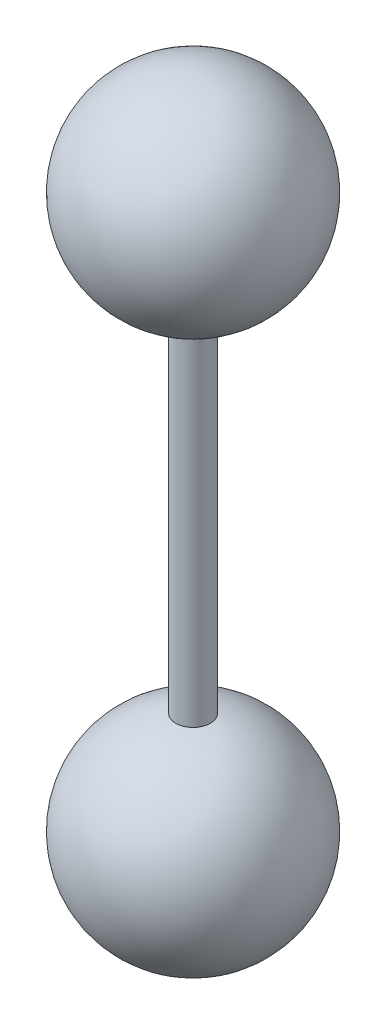
ISO-10303-21;
HEADER;
FILE_DESCRIPTION(('STEP AP214'),'2;1');
FILE_NAME('part.step','',(''),(''),'','','');
FILE_SCHEMA(('AUTOMOTIVE_DESIGN { 1 0 10303 214 1 1 1 1 }'));
ENDSEC;
DATA;
#1=APPLICATION_CONTEXT('core data for automotive mechanical design processes');
#2=APPLICATION_PROTOCOL_DEFINITION('international standard','automotive_design',2000,#1);
#3=PRODUCT_CONTEXT('',#1,'mechanical');
#4=PRODUCT('Part','Part','',(#3));
#5=PRODUCT_RELATED_PRODUCT_CATEGORY('part','',(#4));
#6=PRODUCT_DEFINITION_FORMATION('','',#4);
#7=PRODUCT_DEFINITION_CONTEXT('part definition',#1,'design');
#8=PRODUCT_DEFINITION('design','',#6,#7);
#9=PRODUCT_DEFINITION_SHAPE('','',#8);
#10=(LENGTH_UNIT() NAMED_UNIT(*) SI_UNIT(.MILLI.,.METRE.));
#11=(NAMED_UNIT(*) PLANE_ANGLE_UNIT() SI_UNIT($,.RADIAN.));
#12=(NAMED_UNIT(*) SI_UNIT($,.STERADIAN.) SOLID_ANGLE_UNIT());
#13=UNCERTAINTY_MEASURE_WITH_UNIT(LENGTH_MEASURE(1.E-05),#10,'distance_accuracy_value','');
#14=(GEOMETRIC_REPRESENTATION_CONTEXT(3) GLOBAL_UNCERTAINTY_ASSIGNED_CONTEXT((#13)) GLOBAL_UNIT_ASSIGNED_CONTEXT((#10,
#11,#12)) REPRESENTATION_CONTEXT('',''));
#15=CARTESIAN_POINT('',(0.,0.,0.));
#16=DIRECTION('',(0.,0.,1.));
#17=DIRECTION('',(1.,0.,0.));
#18=AXIS2_PLACEMENT_3D('',#15,#16,#17);
#19=CARTESIAN_POINT('',(0.,5.5,0.));
#20=DIRECTION('',(0.,1.,0.));
#21=DIRECTION('',(0.,0.,1.));
#22=AXIS2_PLACEMENT_3D('',#19,#20,#21);
#23=CYLINDRICAL_SURFACE('',#22,0.25);
#24=CARTESIAN_POINT('',(0.,2.5209800542251,0.));
#25=DIRECTION('',(0.,1.,0.));
#26=DIRECTION('',(0.,0.,1.));
#27=AXIS2_PLACEMENT_3D('',#24,#25,#26);
#28=CIRCLE('',#27,0.25);
#29=CARTESIAN_POINT('',(0.,2.5209800542251,0.25));
#30=VERTEX_POINT('',#29);
#31=EDGE_CURVE('E10',#30,#30,#28,.T.);
#32=ORIENTED_EDGE('',*,*,#31,.F.);
#33=EDGE_LOOP('',(#32));
#34=FACE_BOUND('',#33,.T.);
#35=CARTESIAN_POINT('',(0.,-2.5209800542251,0.));
#36=DIRECTION('',(0.,1.,0.));
#37=DIRECTION('',(0.,0.,1.));
#38=AXIS2_PLACEMENT_3D('',#35,#36,#37);
#39=CIRCLE('',#38,0.25);
#40=CARTESIAN_POINT('',(0.,-2.5209800542251,0.25));
#41=VERTEX_POINT('',#40);
#42=EDGE_CURVE('E40',#41,#41,#39,.T.);
#43=ORIENTED_EDGE('',*,*,#42,.T.);
#44=EDGE_LOOP('',(#43));
#45=FACE_BOUND('',#44,.T.);
#46=ADVANCED_FACE('F34',(#34,#45),#23,.T.);
#47=CARTESIAN_POINT('',(0.,4.,0.));
#48=DIRECTION('',(0.,1.,0.));
#49=DIRECTION('',(1.,0.,0.));
#50=AXIS2_PLACEMENT_3D('',#47,#48,#49);
#51=SPHERICAL_SURFACE('',#50,1.5);
#52=ORIENTED_EDGE('',*,*,#31,.T.);
#53=EDGE_LOOP('',(#52));
#54=FACE_BOUND('',#53,.T.);
#55=ADVANCED_FACE('F49',(#54),#51,.T.);
#56=CARTESIAN_POINT('',(0.,-4.,0.));
#57=DIRECTION('',(0.,-1.,0.));
#58=DIRECTION('',(1.,0.,0.));
#59=AXIS2_PLACEMENT_3D('',#56,#57,#58);
#60=SPHERICAL_SURFACE('',#59,1.5);
#61=ORIENTED_EDGE('',*,*,#42,.F.);
#62=EDGE_LOOP('',(#61));
#63=FACE_BOUND('',#62,.T.);
#64=ADVANCED_FACE('F47',(#63),#60,.T.);
#65=CLOSED_SHELL('',(#46,#55,#64));
#66=MANIFOLD_SOLID_BREP('B2',#65);
#67=ADVANCED_BREP_SHAPE_REPRESENTATION('',(#18,#66),#14);
#68=SHAPE_DEFINITION_REPRESENTATION(#9,#67);
ENDSEC;
END-ISO-10303-21;
